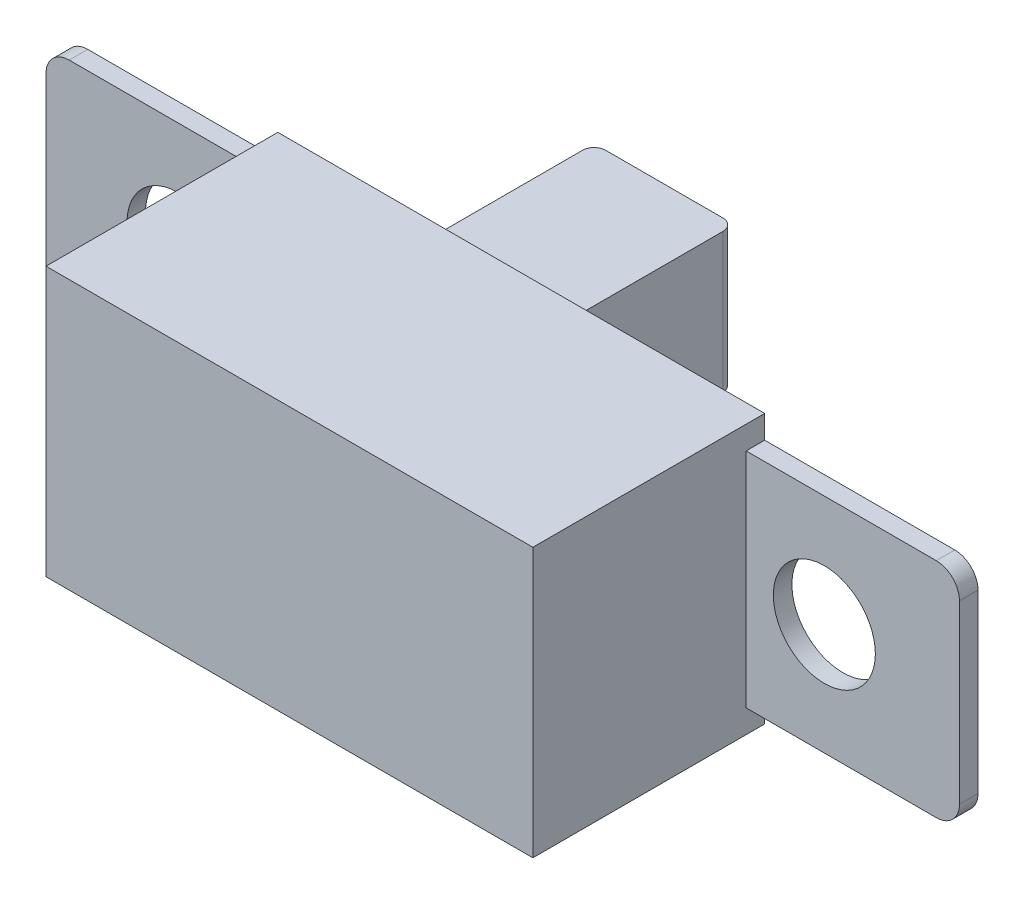
ISO-10303-21;
HEADER;
FILE_DESCRIPTION(('STEP AP214'),'2;1');
FILE_NAME('part.step','',(''),(''),'','','');
FILE_SCHEMA(('AUTOMOTIVE_DESIGN { 1 0 10303 214 1 1 1 1 }'));
ENDSEC;
DATA;
#1=APPLICATION_CONTEXT('core data for automotive mechanical design processes');
#2=APPLICATION_PROTOCOL_DEFINITION('international standard','automotive_design',2000,#1);
#3=PRODUCT_CONTEXT('',#1,'mechanical');
#4=PRODUCT('Part','Part','',(#3));
#5=PRODUCT_RELATED_PRODUCT_CATEGORY('part','',(#4));
#6=PRODUCT_DEFINITION_FORMATION('','',#4);
#7=PRODUCT_DEFINITION_CONTEXT('part definition',#1,'design');
#8=PRODUCT_DEFINITION('design','',#6,#7);
#9=PRODUCT_DEFINITION_SHAPE('','',#8);
#10=(LENGTH_UNIT() NAMED_UNIT(*) SI_UNIT(.MILLI.,.METRE.));
#11=(NAMED_UNIT(*) PLANE_ANGLE_UNIT() SI_UNIT($,.RADIAN.));
#12=(NAMED_UNIT(*) SI_UNIT($,.STERADIAN.) SOLID_ANGLE_UNIT());
#13=UNCERTAINTY_MEASURE_WITH_UNIT(LENGTH_MEASURE(1.E-05),#10,'distance_accuracy_value','');
#14=(GEOMETRIC_REPRESENTATION_CONTEXT(3) GLOBAL_UNCERTAINTY_ASSIGNED_CONTEXT((#13)) GLOBAL_UNIT_ASSIGNED_CONTEXT((#10,
#11,#12)) REPRESENTATION_CONTEXT('',''));
#15=CARTESIAN_POINT('',(0.,0.,0.));
#16=DIRECTION('',(0.,0.,1.));
#17=DIRECTION('',(1.,0.,0.));
#18=AXIS2_PLACEMENT_3D('',#15,#16,#17);
#19=CARTESIAN_POINT('',(-3.48412188827011,1.5,0.4));
#20=DIRECTION('',(0.,-1.,0.));
#21=DIRECTION('',(0.,0.,-1.));
#22=AXIS2_PLACEMENT_3D('',#19,#20,#21);
#23=PLANE('',#22);
#24=DIRECTION('',(-1.,0.,0.));
#25=VECTOR('',#24,1.);
#26=CARTESIAN_POINT('',(-3.48412188827011,1.5,0.));
#27=LINE('',#26,#25);
#28=CARTESIAN_POINT('',(-3.02908302266392,1.5,0.));
#29=VERTEX_POINT('',#28);
#30=CARTESIAN_POINT('',(-3.48412188827011,1.5,0.));
#31=VERTEX_POINT('',#30);
#32=EDGE_CURVE('E238',#29,#31,#27,.T.);
#33=ORIENTED_EDGE('',*,*,#32,.F.);
#34=DIRECTION('',(0.,0.,1.));
#35=VECTOR('',#34,1.);
#36=CARTESIAN_POINT('',(-3.02908302266392,1.5,-4.6));
#37=LINE('',#36,#35);
#38=CARTESIAN_POINT('',(-3.02908302266392,1.5,0.4));
#39=VERTEX_POINT('',#38);
#40=EDGE_CURVE('E225',#29,#39,#37,.T.);
#41=ORIENTED_EDGE('',*,*,#40,.T.);
#42=DIRECTION('',(-1.,0.,0.));
#43=VECTOR('',#42,1.);
#44=CARTESIAN_POINT('',(-3.48412188827011,1.5,0.4));
#45=LINE('',#44,#43);
#46=CARTESIAN_POINT('',(-3.48412188827011,1.5,0.4));
#47=VERTEX_POINT('',#46);
#48=EDGE_CURVE('E236',#39,#47,#45,.T.);
#49=ORIENTED_EDGE('',*,*,#48,.T.);
#50=DIRECTION('',(0.,0.,-1.));
#51=VECTOR('',#50,1.);
#52=CARTESIAN_POINT('',(-3.48412188827011,1.5,0.4));
#53=LINE('',#52,#51);
#54=EDGE_CURVE('E279',#47,#31,#53,.T.);
#55=ORIENTED_EDGE('',*,*,#54,.T.);
#56=EDGE_LOOP('',(#33,#41,#49,#55));
#57=FACE_BOUND('',#56,.T.);
#58=ADVANCED_FACE('F38',(#57),#23,.T.);
#59=CARTESIAN_POINT('',(3.36036353667346,1.5,0.4));
#60=VERTEX_POINT('',#59);
#61=CARTESIAN_POINT('',(0.,1.5,0.4));
#62=VERTEX_POINT('',#61);
#63=EDGE_CURVE('E247',#60,#62,#45,.T.);
#64=ORIENTED_EDGE('',*,*,#63,.T.);
#65=DIRECTION('',(0.,0.,1.));
#66=VECTOR('',#65,1.);
#67=CARTESIAN_POINT('',(0.,1.5,-4.6));
#68=LINE('',#67,#66);
#69=CARTESIAN_POINT('',(0.,1.5,0.));
#70=VERTEX_POINT('',#69);
#71=EDGE_CURVE('E771',#70,#62,#68,.T.);
#72=ORIENTED_EDGE('',*,*,#71,.F.);
#73=CARTESIAN_POINT('',(3.36036353667346,1.5,0.));
#74=VERTEX_POINT('',#73);
#75=EDGE_CURVE('E265',#74,#70,#27,.T.);
#76=ORIENTED_EDGE('',*,*,#75,.F.);
#77=DIRECTION('',(0.,0.,-1.));
#78=VECTOR('',#77,1.);
#79=CARTESIAN_POINT('',(3.36036353667346,1.5,0.4));
#80=LINE('',#79,#78);
#81=EDGE_CURVE('E281',#60,#74,#80,.T.);
#82=ORIENTED_EDGE('',*,*,#81,.F.);
#83=EDGE_LOOP('',(#64,#72,#76,#82));
#84=FACE_BOUND('',#83,.T.);
#85=ADVANCED_FACE('F512',(#84),#23,.T.);
#86=CARTESIAN_POINT('',(-3.48412188827011,-1.5,0.4));
#87=DIRECTION('',(0.,1.,0.));
#88=DIRECTION('',(0.,0.,1.));
#89=AXIS2_PLACEMENT_3D('',#86,#87,#88);
#90=PLANE('',#89);
#91=DIRECTION('',(1.,0.,0.));
#92=VECTOR('',#91,1.);
#93=CARTESIAN_POINT('',(-3.48412188827011,-1.5,0.4));
#94=LINE('',#93,#92);
#95=CARTESIAN_POINT('',(-3.48412188827012,-1.5,0.4));
#96=VERTEX_POINT('',#95);
#97=CARTESIAN_POINT('',(-3.02908302266392,-1.5,0.4));
#98=VERTEX_POINT('',#97);
#99=EDGE_CURVE('E258',#96,#98,#94,.T.);
#100=ORIENTED_EDGE('',*,*,#99,.T.);
#101=DIRECTION('',(0.,0.,1.));
#102=VECTOR('',#101,1.);
#103=CARTESIAN_POINT('',(-3.02908302266392,-1.5,-4.6));
#104=LINE('',#103,#102);
#105=CARTESIAN_POINT('',(-3.02908302266392,-1.5,0.));
#106=VERTEX_POINT('',#105);
#107=EDGE_CURVE('E228',#106,#98,#104,.T.);
#108=ORIENTED_EDGE('',*,*,#107,.F.);
#109=DIRECTION('',(1.,0.,0.));
#110=VECTOR('',#109,1.);
#111=CARTESIAN_POINT('',(-3.48412188827011,-1.5,0.));
#112=LINE('',#111,#110);
#113=CARTESIAN_POINT('',(-3.48412188827011,-1.5,0.));
#114=VERTEX_POINT('',#113);
#115=EDGE_CURVE('E252',#114,#106,#112,.T.);
#116=ORIENTED_EDGE('',*,*,#115,.F.);
#117=DIRECTION('',(0.,0.,-1.));
#118=VECTOR('',#117,1.);
#119=CARTESIAN_POINT('',(-3.48412188827011,-1.5,0.4));
#120=LINE('',#119,#118);
#121=EDGE_CURVE('E277',#96,#114,#120,.T.);
#122=ORIENTED_EDGE('',*,*,#121,.F.);
#123=EDGE_LOOP('',(#100,#108,#116,#122));
#124=FACE_BOUND('',#123,.T.);
#125=ADVANCED_FACE('F517',(#124),#90,.T.);
#126=CARTESIAN_POINT('',(0.,-1.5,0.));
#127=VERTEX_POINT('',#126);
#128=CARTESIAN_POINT('',(3.36036353667346,-1.5,0.));
#129=VERTEX_POINT('',#128);
#130=EDGE_CURVE('E272',#127,#129,#112,.T.);
#131=ORIENTED_EDGE('',*,*,#130,.F.);
#132=DIRECTION('',(0.,0.,1.));
#133=VECTOR('',#132,1.);
#134=CARTESIAN_POINT('',(0.,-1.5,-4.6));
#135=LINE('',#134,#133);
#136=CARTESIAN_POINT('',(0.,-1.5,0.4));
#137=VERTEX_POINT('',#136);
#138=EDGE_CURVE('E775',#127,#137,#135,.T.);
#139=ORIENTED_EDGE('',*,*,#138,.T.);
#140=CARTESIAN_POINT('',(3.36036353667346,-1.5,0.4));
#141=VERTEX_POINT('',#140);
#142=EDGE_CURVE('E257',#137,#141,#94,.T.);
#143=ORIENTED_EDGE('',*,*,#142,.T.);
#144=DIRECTION('',(0.,0.,-1.));
#145=VECTOR('',#144,1.);
#146=CARTESIAN_POINT('',(3.36036353667346,-1.5,0.4));
#147=LINE('',#146,#145);
#148=EDGE_CURVE('E260',#141,#129,#147,.T.);
#149=ORIENTED_EDGE('',*,*,#148,.T.);
#150=EDGE_LOOP('',(#131,#139,#143,#149));
#151=FACE_BOUND('',#150,.T.);
#152=ADVANCED_FACE('F736',(#151),#90,.T.);
#153=CARTESIAN_POINT('',(-5.25,-14.3634200830293,0.4));
#154=DIRECTION('',(0.,0.,-1.));
#155=DIRECTION('',(-1.,0.,0.));
#156=AXIS2_PLACEMENT_3D('',#153,#154,#155);
#157=PLANE('',#156);
#158=ORIENTED_EDGE('',*,*,#48,.F.);
#159=DIRECTION('',(0.,1.,0.));
#160=VECTOR('',#159,1.);
#161=CARTESIAN_POINT('',(-3.02908302266392,-1.5,0.4));
#162=LINE('',#161,#160);
#163=EDGE_CURVE('E222',#98,#39,#162,.T.);
#164=ORIENTED_EDGE('',*,*,#163,.F.);
#165=ORIENTED_EDGE('',*,*,#99,.F.);
#166=DIRECTION('',(0.,-1.,0.));
#167=VECTOR('',#166,1.);
#168=CARTESIAN_POINT('',(-3.48412188827011,-1.5,0.4));
#169=LINE('',#168,#167);
#170=EDGE_CURVE('E245',#47,#96,#169,.T.);
#171=ORIENTED_EDGE('',*,*,#170,.F.);
#172=EDGE_LOOP('',(#158,#164,#165,#171));
#173=FACE_BOUND('',#172,.T.);
#174=ADVANCED_FACE('F243',(#173),#157,.T.);
#175=ORIENTED_EDGE('',*,*,#142,.F.);
#176=DIRECTION('',(0.,-1.,0.));
#177=VECTOR('',#176,1.);
#178=CARTESIAN_POINT('',(0.,-1.5,0.4));
#179=LINE('',#178,#177);
#180=EDGE_CURVE('E232',#62,#137,#179,.T.);
#181=ORIENTED_EDGE('',*,*,#180,.F.);
#182=ORIENTED_EDGE('',*,*,#63,.F.);
#183=DIRECTION('',(0.,1.,0.));
#184=VECTOR('',#183,1.);
#185=CARTESIAN_POINT('',(3.36036353667346,-1.5,0.4));
#186=LINE('',#185,#184);
#187=EDGE_CURVE('E248',#141,#60,#186,.T.);
#188=ORIENTED_EDGE('',*,*,#187,.F.);
#189=EDGE_LOOP('',(#175,#181,#182,#188));
#190=FACE_BOUND('',#189,.T.);
#191=ADVANCED_FACE('F722',(#190),#157,.T.);
#192=CARTESIAN_POINT('',(-9.35,1.9,0.4));
#193=DIRECTION('',(0.,0.,-1.));
#194=DIRECTION('',(-1.,0.,0.));
#195=AXIS2_PLACEMENT_3D('',#192,#193,#194);
#196=PLANE('',#195);
#197=CARTESIAN_POINT('',(6.93630364388336,0.,0.4));
#198=DIRECTION('',(0.,0.,1.));
#199=DIRECTION('',(1.,0.,0.));
#200=AXIS2_PLACEMENT_3D('',#197,#198,#199);
#201=CIRCLE('',#200,1.1);
#202=CARTESIAN_POINT('',(8.03630364388336,0.,0.4));
#203=VERTEX_POINT('',#202);
#204=EDGE_CURVE('E285',#203,#203,#201,.T.);
#205=ORIENTED_EDGE('',*,*,#204,.F.);
#206=EDGE_LOOP('',(#205));
#207=FACE_BOUND('',#206,.T.);
#208=DIRECTION('',(0.,1.,0.));
#209=VECTOR('',#208,1.);
#210=CARTESIAN_POINT('',(5.25,-14.3634200830293,0.4));
#211=LINE('',#210,#209);
#212=CARTESIAN_POINT('',(5.25,-2.4,0.4));
#213=VERTEX_POINT('',#212);
#214=CARTESIAN_POINT('',(5.25,2.4,0.4));
#215=VERTEX_POINT('',#214);
#216=EDGE_CURVE('E397',#213,#215,#211,.T.);
#217=ORIENTED_EDGE('',*,*,#216,.F.);
#218=DIRECTION('',(1.,0.,0.));
#219=VECTOR('',#218,1.);
#220=CARTESIAN_POINT('',(5.25,-2.4,0.4));
#221=LINE('',#220,#219);
#222=CARTESIAN_POINT('',(9.35,-2.4,0.4));
#223=VERTEX_POINT('',#222);
#224=EDGE_CURVE('E308',#213,#223,#221,.T.);
#225=ORIENTED_EDGE('',*,*,#224,.T.);
#226=CARTESIAN_POINT('',(9.35,-1.9,0.4));
#227=DIRECTION('',(0.,0.,1.));
#228=DIRECTION('',(1.,0.,0.));
#229=AXIS2_PLACEMENT_3D('',#226,#227,#228);
#230=CIRCLE('',#229,0.5);
#231=CARTESIAN_POINT('',(9.85,-1.9,0.4));
#232=VERTEX_POINT('',#231);
#233=EDGE_CURVE('E310',#223,#232,#230,.T.);
#234=ORIENTED_EDGE('',*,*,#233,.T.);
#235=DIRECTION('',(0.,1.,0.));
#236=VECTOR('',#235,1.);
#237=CARTESIAN_POINT('',(9.85,-1.9,0.4));
#238=LINE('',#237,#236);
#239=CARTESIAN_POINT('',(9.85,1.9,0.4));
#240=VERTEX_POINT('',#239);
#241=EDGE_CURVE('E312',#232,#240,#238,.T.);
#242=ORIENTED_EDGE('',*,*,#241,.T.);
#243=CARTESIAN_POINT('',(9.35,1.9,0.4));
#244=DIRECTION('',(0.,0.,1.));
#245=DIRECTION('',(-1.,0.,0.));
#246=AXIS2_PLACEMENT_3D('',#243,#244,#245);
#247=CIRCLE('',#246,0.5);
#248=CARTESIAN_POINT('',(9.35,2.4,0.4));
#249=VERTEX_POINT('',#248);
#250=EDGE_CURVE('E314',#240,#249,#247,.T.);
#251=ORIENTED_EDGE('',*,*,#250,.T.);
#252=DIRECTION('',(-1.,0.,0.));
#253=VECTOR('',#252,1.);
#254=CARTESIAN_POINT('',(5.25,2.4,0.4));
#255=LINE('',#254,#253);
#256=EDGE_CURVE('E316',#249,#215,#255,.T.);
#257=ORIENTED_EDGE('',*,*,#256,.T.);
#258=EDGE_LOOP('',(#217,#225,#234,#242,#251,#257));
#259=FACE_BOUND('',#258,.T.);
#260=ADVANCED_FACE('F538',(#207,#259),#196,.F.);
#261=CARTESIAN_POINT('',(-7.00196748145124,0.,0.4));
#262=DIRECTION('',(0.,0.,1.));
#263=DIRECTION('',(1.,0.,0.));
#264=AXIS2_PLACEMENT_3D('',#261,#262,#263);
#265=CIRCLE('',#264,1.1);
#266=CARTESIAN_POINT('',(-5.90196748145124,0.,0.4));
#267=VERTEX_POINT('',#266);
#268=EDGE_CURVE('E291',#267,#267,#265,.T.);
#269=ORIENTED_EDGE('',*,*,#268,.F.);
#270=EDGE_LOOP('',(#269));
#271=FACE_BOUND('',#270,.T.);
#272=DIRECTION('',(1.,0.,0.));
#273=VECTOR('',#272,1.);
#274=CARTESIAN_POINT('',(-9.34999999999999,-2.4,0.4));
#275=LINE('',#274,#273);
#276=CARTESIAN_POINT('',(-9.34999999999999,-2.4,0.4));
#277=VERTEX_POINT('',#276);
#278=CARTESIAN_POINT('',(-5.25,-2.4,0.4));
#279=VERTEX_POINT('',#278);
#280=EDGE_CURVE('E306',#277,#279,#275,.T.);
#281=ORIENTED_EDGE('',*,*,#280,.T.);
#282=DIRECTION('',(0.,1.,0.));
#283=VECTOR('',#282,1.);
#284=CARTESIAN_POINT('',(-5.25,-14.3634200830293,0.4));
#285=LINE('',#284,#283);
#286=CARTESIAN_POINT('',(-5.25,2.4,0.4));
#287=VERTEX_POINT('',#286);
#288=EDGE_CURVE('E402',#279,#287,#285,.T.);
#289=ORIENTED_EDGE('',*,*,#288,.T.);
#290=DIRECTION('',(-1.,0.,0.));
#291=VECTOR('',#290,1.);
#292=CARTESIAN_POINT('',(-9.34999999999999,2.4,0.4));
#293=LINE('',#292,#291);
#294=CARTESIAN_POINT('',(-9.34999999999999,2.4,0.4));
#295=VERTEX_POINT('',#294);
#296=EDGE_CURVE('E297',#287,#295,#293,.T.);
#297=ORIENTED_EDGE('',*,*,#296,.T.);
#298=CARTESIAN_POINT('',(-9.35,1.9,0.4));
#299=DIRECTION('',(0.,0.,1.));
#300=DIRECTION('',(-1.,0.,0.));
#301=AXIS2_PLACEMENT_3D('',#298,#299,#300);
#302=CIRCLE('',#301,0.5);
#303=CARTESIAN_POINT('',(-9.85,1.9,0.4));
#304=VERTEX_POINT('',#303);
#305=EDGE_CURVE('E299',#295,#304,#302,.T.);
#306=ORIENTED_EDGE('',*,*,#305,.T.);
#307=DIRECTION('',(0.,-1.,0.));
#308=VECTOR('',#307,1.);
#309=CARTESIAN_POINT('',(-9.85,-1.9,0.4));
#310=LINE('',#309,#308);
#311=CARTESIAN_POINT('',(-9.85,-1.9,0.4));
#312=VERTEX_POINT('',#311);
#313=EDGE_CURVE('E302',#304,#312,#310,.T.);
#314=ORIENTED_EDGE('',*,*,#313,.T.);
#315=CARTESIAN_POINT('',(-9.35,-1.9,0.4));
#316=DIRECTION('',(0.,0.,1.));
#317=DIRECTION('',(-1.,0.,0.));
#318=AXIS2_PLACEMENT_3D('',#315,#316,#317);
#319=CIRCLE('',#318,0.5);
#320=EDGE_CURVE('E304',#312,#277,#319,.T.);
#321=ORIENTED_EDGE('',*,*,#320,.T.);
#322=EDGE_LOOP('',(#281,#289,#297,#306,#314,#321));
#323=FACE_BOUND('',#322,.T.);
#324=ADVANCED_FACE('F487',(#271,#323),#196,.F.);
#325=CARTESIAN_POINT('',(-9.35,1.9,0.));
#326=DIRECTION('',(0.,0.,-1.));
#327=DIRECTION('',(-1.,0.,0.));
#328=AXIS2_PLACEMENT_3D('',#325,#326,#327);
#329=PLANE('',#328);
#330=CARTESIAN_POINT('',(-7.00196748145124,0.,0.));
#331=DIRECTION('',(0.,0.,1.));
#332=DIRECTION('',(1.,0.,0.));
#333=AXIS2_PLACEMENT_3D('',#330,#331,#332);
#334=CIRCLE('',#333,1.1);
#335=CARTESIAN_POINT('',(-5.90196748145124,0.,0.));
#336=VERTEX_POINT('',#335);
#337=EDGE_CURVE('E288',#336,#336,#334,.T.);
#338=ORIENTED_EDGE('',*,*,#337,.T.);
#339=EDGE_LOOP('',(#338));
#340=FACE_BOUND('',#339,.T.);
#341=DIRECTION('',(0.,1.,0.));
#342=VECTOR('',#341,1.);
#343=CARTESIAN_POINT('',(5.25,2.4,0.));
#344=LINE('',#343,#342);
#345=CARTESIAN_POINT('',(5.25,2.4,0.));
#346=VERTEX_POINT('',#345);
#347=CARTESIAN_POINT('',(5.25,2.9,0.));
#348=VERTEX_POINT('',#347);
#349=EDGE_CURVE('E294',#346,#348,#344,.T.);
#350=ORIENTED_EDGE('',*,*,#349,.F.);
#351=DIRECTION('',(-1.,0.,0.));
#352=VECTOR('',#351,1.);
#353=CARTESIAN_POINT('',(5.25,2.4,0.));
#354=LINE('',#353,#352);
#355=CARTESIAN_POINT('',(9.35,2.4,0.));
#356=VERTEX_POINT('',#355);
#357=EDGE_CURVE('E300',#356,#346,#354,.T.);
#358=ORIENTED_EDGE('',*,*,#357,.F.);
#359=CARTESIAN_POINT('',(9.35,1.9,0.));
#360=DIRECTION('',(0.,0.,1.));
#361=DIRECTION('',(-1.,0.,0.));
#362=AXIS2_PLACEMENT_3D('',#359,#360,#361);
#363=CIRCLE('',#362,0.5);
#364=CARTESIAN_POINT('',(9.85,1.9,0.));
#365=VERTEX_POINT('',#364);
#366=EDGE_CURVE('E347',#365,#356,#363,.T.);
#367=ORIENTED_EDGE('',*,*,#366,.F.);
#368=DIRECTION('',(0.,1.,0.));
#369=VECTOR('',#368,1.);
#370=CARTESIAN_POINT('',(9.85,-1.9,0.));
#371=LINE('',#370,#369);
#372=CARTESIAN_POINT('',(9.85,-1.9,0.));
#373=VERTEX_POINT('',#372);
#374=EDGE_CURVE('E345',#373,#365,#371,.T.);
#375=ORIENTED_EDGE('',*,*,#374,.F.);
#376=CARTESIAN_POINT('',(9.35,-1.9,0.));
#377=DIRECTION('',(0.,0.,1.));
#378=DIRECTION('',(1.,0.,0.));
#379=AXIS2_PLACEMENT_3D('',#376,#377,#378);
#380=CIRCLE('',#379,0.5);
#381=CARTESIAN_POINT('',(9.35,-2.4,0.));
#382=VERTEX_POINT('',#381);
#383=EDGE_CURVE('E343',#382,#373,#380,.T.);
#384=ORIENTED_EDGE('',*,*,#383,.F.);
#385=DIRECTION('',(1.,0.,0.));
#386=VECTOR('',#385,1.);
#387=CARTESIAN_POINT('',(5.25,-2.4,0.));
#388=LINE('',#387,#386);
#389=CARTESIAN_POINT('',(5.25,-2.4,0.));
#390=VERTEX_POINT('',#389);
#391=EDGE_CURVE('E341',#390,#382,#388,.T.);
#392=ORIENTED_EDGE('',*,*,#391,.F.);
#393=DIRECTION('',(0.,1.,0.));
#394=VECTOR('',#393,1.);
#395=CARTESIAN_POINT('',(5.25,-2.9,0.));
#396=LINE('',#395,#394);
#397=CARTESIAN_POINT('',(5.25,-2.9,0.));
#398=VERTEX_POINT('',#397);
#399=EDGE_CURVE('E339',#398,#390,#396,.T.);
#400=ORIENTED_EDGE('',*,*,#399,.F.);
#401=DIRECTION('',(1.,0.,0.));
#402=VECTOR('',#401,1.);
#403=CARTESIAN_POINT('',(-5.25,-2.9,0.));
#404=LINE('',#403,#402);
#405=CARTESIAN_POINT('',(-5.25,-2.9,0.));
#406=VERTEX_POINT('',#405);
#407=EDGE_CURVE('E337',#406,#398,#404,.T.);
#408=ORIENTED_EDGE('',*,*,#407,.F.);
#409=DIRECTION('',(0.,-1.,0.));
#410=VECTOR('',#409,1.);
#411=CARTESIAN_POINT('',(-5.25,-2.9,0.));
#412=LINE('',#411,#410);
#413=CARTESIAN_POINT('',(-5.25,-2.4,0.));
#414=VERTEX_POINT('',#413);
#415=EDGE_CURVE('E335',#414,#406,#412,.T.);
#416=ORIENTED_EDGE('',*,*,#415,.F.);
#417=DIRECTION('',(1.,0.,0.));
#418=VECTOR('',#417,1.);
#419=CARTESIAN_POINT('',(-9.34999999999999,-2.4,0.));
#420=LINE('',#419,#418);
#421=CARTESIAN_POINT('',(-9.34999999999999,-2.4,0.));
#422=VERTEX_POINT('',#421);
#423=EDGE_CURVE('E333',#422,#414,#420,.T.);
#424=ORIENTED_EDGE('',*,*,#423,.F.);
#425=CARTESIAN_POINT('',(-9.35,-1.9,0.));
#426=DIRECTION('',(0.,0.,1.));
#427=DIRECTION('',(-1.,0.,0.));
#428=AXIS2_PLACEMENT_3D('',#425,#426,#427);
#429=CIRCLE('',#428,0.5);
#430=CARTESIAN_POINT('',(-9.85,-1.9,0.));
#431=VERTEX_POINT('',#430);
#432=EDGE_CURVE('E331',#431,#422,#429,.T.);
#433=ORIENTED_EDGE('',*,*,#432,.F.);
#434=DIRECTION('',(0.,-1.,0.));
#435=VECTOR('',#434,1.);
#436=CARTESIAN_POINT('',(-9.85,-1.9,0.));
#437=LINE('',#436,#435);
#438=CARTESIAN_POINT('',(-9.85,1.9,0.));
#439=VERTEX_POINT('',#438);
#440=EDGE_CURVE('E329',#439,#431,#437,.T.);
#441=ORIENTED_EDGE('',*,*,#440,.F.);
#442=CARTESIAN_POINT('',(-9.35,1.9,0.));
#443=DIRECTION('',(0.,0.,1.));
#444=DIRECTION('',(-1.,0.,0.));
#445=AXIS2_PLACEMENT_3D('',#442,#443,#444);
#446=CIRCLE('',#445,0.5);
#447=CARTESIAN_POINT('',(-9.34999999999999,2.4,0.));
#448=VERTEX_POINT('',#447);
#449=EDGE_CURVE('E327',#448,#439,#446,.T.);
#450=ORIENTED_EDGE('',*,*,#449,.F.);
#451=DIRECTION('',(-1.,0.,0.));
#452=VECTOR('',#451,1.);
#453=CARTESIAN_POINT('',(-9.34999999999999,2.4,0.));
#454=LINE('',#453,#452);
#455=CARTESIAN_POINT('',(-5.25,2.4,0.));
#456=VERTEX_POINT('',#455);
#457=EDGE_CURVE('E325',#456,#448,#454,.T.);
#458=ORIENTED_EDGE('',*,*,#457,.F.);
#459=DIRECTION('',(0.,-1.,0.));
#460=VECTOR('',#459,1.);
#461=CARTESIAN_POINT('',(-5.25,2.4,0.));
#462=LINE('',#461,#460);
#463=CARTESIAN_POINT('',(-5.25,2.9,0.));
#464=VERTEX_POINT('',#463);
#465=EDGE_CURVE('E323',#464,#456,#462,.T.);
#466=ORIENTED_EDGE('',*,*,#465,.F.);
#467=DIRECTION('',(-1.,0.,0.));
#468=VECTOR('',#467,1.);
#469=CARTESIAN_POINT('',(-5.25,2.9,0.));
#470=LINE('',#469,#468);
#471=EDGE_CURVE('E321',#348,#464,#470,.T.);
#472=ORIENTED_EDGE('',*,*,#471,.F.);
#473=EDGE_LOOP('',(#350,#358,#367,#375,#384,#392,#400,#408,#416,#424,#433,#441,#450,#458,#466,#472));
#474=FACE_BOUND('',#473,.T.);
#475=CARTESIAN_POINT('',(6.93630364388336,0.,0.));
#476=DIRECTION('',(0.,0.,1.));
#477=DIRECTION('',(1.,0.,0.));
#478=AXIS2_PLACEMENT_3D('',#475,#476,#477);
#479=CIRCLE('',#478,1.1);
#480=CARTESIAN_POINT('',(8.03630364388336,0.,0.));
#481=VERTEX_POINT('',#480);
#482=EDGE_CURVE('E284',#481,#481,#479,.T.);
#483=ORIENTED_EDGE('',*,*,#482,.T.);
#484=EDGE_LOOP('',(#483));
#485=FACE_BOUND('',#484,.T.);
#486=ORIENTED_EDGE('',*,*,#115,.T.);
#487=DIRECTION('',(1.,0.,0.));
#488=VECTOR('',#487,1.);
#489=CARTESIAN_POINT('',(-9.35,-1.5,0.));
#490=LINE('',#489,#488);
#491=EDGE_CURVE('E429',#106,#127,#490,.T.);
#492=ORIENTED_EDGE('',*,*,#491,.T.);
#493=ORIENTED_EDGE('',*,*,#130,.T.);
#494=DIRECTION('',(0.,1.,0.));
#495=VECTOR('',#494,1.);
#496=CARTESIAN_POINT('',(3.36036353667346,-1.5,0.));
#497=LINE('',#496,#495);
#498=EDGE_CURVE('E261',#129,#74,#497,.T.);
#499=ORIENTED_EDGE('',*,*,#498,.T.);
#500=ORIENTED_EDGE('',*,*,#75,.T.);
#501=DIRECTION('',(-1.,0.,0.));
#502=VECTOR('',#501,1.);
#503=CARTESIAN_POINT('',(-9.35,1.5,0.));
#504=LINE('',#503,#502);
#505=EDGE_CURVE('E431',#70,#29,#504,.T.);
#506=ORIENTED_EDGE('',*,*,#505,.T.);
#507=ORIENTED_EDGE('',*,*,#32,.T.);
#508=DIRECTION('',(0.,-1.,0.));
#509=VECTOR('',#508,1.);
#510=CARTESIAN_POINT('',(-3.48412188827011,-1.5,0.));
#511=LINE('',#510,#509);
#512=EDGE_CURVE('E268',#31,#114,#511,.T.);
#513=ORIENTED_EDGE('',*,*,#512,.T.);
#514=EDGE_LOOP('',(#486,#492,#493,#499,#500,#506,#507,#513));
#515=FACE_BOUND('',#514,.T.);
#516=ADVANCED_FACE('F467',(#340,#474,#485,#515),#329,.T.);
#517=CARTESIAN_POINT('',(-5.25,2.9,0.4));
#518=DIRECTION('',(0.,-1.,0.));
#519=DIRECTION('',(0.,0.,-1.));
#520=AXIS2_PLACEMENT_3D('',#517,#518,#519);
#521=PLANE('',#520);
#522=ORIENTED_EDGE('',*,*,#471,.T.);
#523=DIRECTION('',(0.,0.,-1.));
#524=VECTOR('',#523,1.);
#525=CARTESIAN_POINT('',(-5.25,2.9,0.4));
#526=LINE('',#525,#524);
#527=CARTESIAN_POINT('',(-5.25,2.9,5.));
#528=VERTEX_POINT('',#527);
#529=EDGE_CURVE('E391',#528,#464,#526,.T.);
#530=ORIENTED_EDGE('',*,*,#529,.F.);
#531=DIRECTION('',(1.,0.,0.));
#532=VECTOR('',#531,1.);
#533=CARTESIAN_POINT('',(-5.25,2.9,5.));
#534=LINE('',#533,#532);
#535=CARTESIAN_POINT('',(5.25,2.9,5.));
#536=VERTEX_POINT('',#535);
#537=EDGE_CURVE('E437',#528,#536,#534,.T.);
#538=ORIENTED_EDGE('',*,*,#537,.T.);
#539=DIRECTION('',(0.,0.,-1.));
#540=VECTOR('',#539,1.);
#541=CARTESIAN_POINT('',(5.25,2.9,0.4));
#542=LINE('',#541,#540);
#543=EDGE_CURVE('E394',#536,#348,#542,.T.);
#544=ORIENTED_EDGE('',*,*,#543,.T.);
#545=EDGE_LOOP('',(#522,#530,#538,#544));
#546=FACE_BOUND('',#545,.T.);
#547=ADVANCED_FACE('F476',(#546),#521,.F.);
#548=CARTESIAN_POINT('',(-9.34999999999999,2.4,0.4));
#549=DIRECTION('',(0.,-1.,0.));
#550=DIRECTION('',(0.,0.,-1.));
#551=AXIS2_PLACEMENT_3D('',#548,#549,#550);
#552=PLANE('',#551);
#553=ORIENTED_EDGE('',*,*,#457,.T.);
#554=DIRECTION('',(0.,0.,-1.));
#555=VECTOR('',#554,1.);
#556=CARTESIAN_POINT('',(-9.34999999999999,2.4,0.4));
#557=LINE('',#556,#555);
#558=EDGE_CURVE('E385',#295,#448,#557,.T.);
#559=ORIENTED_EDGE('',*,*,#558,.F.);
#560=ORIENTED_EDGE('',*,*,#296,.F.);
#561=DIRECTION('',(0.,0.,-1.));
#562=VECTOR('',#561,1.);
#563=CARTESIAN_POINT('',(-5.25,2.4,0.4));
#564=LINE('',#563,#562);
#565=EDGE_CURVE('E388',#287,#456,#564,.T.);
#566=ORIENTED_EDGE('',*,*,#565,.T.);
#567=EDGE_LOOP('',(#553,#559,#560,#566));
#568=FACE_BOUND('',#567,.T.);
#569=ADVANCED_FACE('F483',(#568),#552,.F.);
#570=CARTESIAN_POINT('',(-9.35,1.9,0.4));
#571=DIRECTION('',(0.,0.,-1.));
#572=DIRECTION('',(-1.,0.,0.));
#573=AXIS2_PLACEMENT_3D('',#570,#571,#572);
#574=CYLINDRICAL_SURFACE('',#573,0.5);
#575=ORIENTED_EDGE('',*,*,#449,.T.);
#576=DIRECTION('',(0.,0.,-1.));
#577=VECTOR('',#576,1.);
#578=CARTESIAN_POINT('',(-9.85,1.9,0.4));
#579=LINE('',#578,#577);
#580=EDGE_CURVE('E382',#304,#439,#579,.T.);
#581=ORIENTED_EDGE('',*,*,#580,.F.);
#582=ORIENTED_EDGE('',*,*,#305,.F.);
#583=ORIENTED_EDGE('',*,*,#558,.T.);
#584=EDGE_LOOP('',(#575,#581,#582,#583));
#585=FACE_BOUND('',#584,.T.);
#586=ADVANCED_FACE('F502',(#585),#574,.T.);
#587=CARTESIAN_POINT('',(-9.85,-1.9,0.4));
#588=DIRECTION('',(1.,0.,0.));
#589=DIRECTION('',(0.,0.,-1.));
#590=AXIS2_PLACEMENT_3D('',#587,#588,#589);
#591=PLANE('',#590);
#592=ORIENTED_EDGE('',*,*,#440,.T.);
#593=DIRECTION('',(0.,0.,-1.));
#594=VECTOR('',#593,1.);
#595=CARTESIAN_POINT('',(-9.85,-1.9,0.4));
#596=LINE('',#595,#594);
#597=EDGE_CURVE('E379',#312,#431,#596,.T.);
#598=ORIENTED_EDGE('',*,*,#597,.F.);
#599=ORIENTED_EDGE('',*,*,#313,.F.);
#600=ORIENTED_EDGE('',*,*,#580,.T.);
#601=EDGE_LOOP('',(#592,#598,#599,#600));
#602=FACE_BOUND('',#601,.T.);
#603=ADVANCED_FACE('F499',(#602),#591,.F.);
#604=CARTESIAN_POINT('',(-9.35,-1.9,0.4));
#605=DIRECTION('',(0.,0.,-1.));
#606=DIRECTION('',(-1.,0.,0.));
#607=AXIS2_PLACEMENT_3D('',#604,#605,#606);
#608=CYLINDRICAL_SURFACE('',#607,0.5);
#609=ORIENTED_EDGE('',*,*,#432,.T.);
#610=DIRECTION('',(0.,0.,-1.));
#611=VECTOR('',#610,1.);
#612=CARTESIAN_POINT('',(-9.34999999999999,-2.4,0.4));
#613=LINE('',#612,#611);
#614=EDGE_CURVE('E376',#277,#422,#613,.T.);
#615=ORIENTED_EDGE('',*,*,#614,.F.);
#616=ORIENTED_EDGE('',*,*,#320,.F.);
#617=ORIENTED_EDGE('',*,*,#597,.T.);
#618=EDGE_LOOP('',(#609,#615,#616,#617));
#619=FACE_BOUND('',#618,.T.);
#620=ADVANCED_FACE('F495',(#619),#608,.T.);
#621=CARTESIAN_POINT('',(-9.34999999999999,-2.4,0.4));
#622=DIRECTION('',(0.,1.,0.));
#623=DIRECTION('',(0.,0.,1.));
#624=AXIS2_PLACEMENT_3D('',#621,#622,#623);
#625=PLANE('',#624);
#626=ORIENTED_EDGE('',*,*,#423,.T.);
#627=DIRECTION('',(0.,0.,-1.));
#628=VECTOR('',#627,1.);
#629=CARTESIAN_POINT('',(-5.25,-2.4,0.4));
#630=LINE('',#629,#628);
#631=EDGE_CURVE('E373',#279,#414,#630,.T.);
#632=ORIENTED_EDGE('',*,*,#631,.F.);
#633=ORIENTED_EDGE('',*,*,#280,.F.);
#634=ORIENTED_EDGE('',*,*,#614,.T.);
#635=EDGE_LOOP('',(#626,#632,#633,#634));
#636=FACE_BOUND('',#635,.T.);
#637=ADVANCED_FACE('F493',(#636),#625,.F.);
#638=CARTESIAN_POINT('',(-5.25,-2.9,0.4));
#639=DIRECTION('',(1.,0.,0.));
#640=DIRECTION('',(0.,0.,-1.));
#641=AXIS2_PLACEMENT_3D('',#638,#639,#640);
#642=PLANE('',#641);
#643=ORIENTED_EDGE('',*,*,#415,.T.);
#644=DIRECTION('',(0.,0.,-1.));
#645=VECTOR('',#644,1.);
#646=CARTESIAN_POINT('',(-5.25,-2.9,0.4));
#647=LINE('',#646,#645);
#648=CARTESIAN_POINT('',(-5.25,-2.9,5.));
#649=VERTEX_POINT('',#648);
#650=EDGE_CURVE('E370',#649,#406,#647,.T.);
#651=ORIENTED_EDGE('',*,*,#650,.F.);
#652=DIRECTION('',(0.,1.,0.));
#653=VECTOR('',#652,1.);
#654=CARTESIAN_POINT('',(-5.25,-14.3634200830293,5.));
#655=LINE('',#654,#653);
#656=EDGE_CURVE('E440',#649,#528,#655,.T.);
#657=ORIENTED_EDGE('',*,*,#656,.T.);
#658=ORIENTED_EDGE('',*,*,#529,.T.);
#659=ORIENTED_EDGE('',*,*,#465,.T.);
#660=ORIENTED_EDGE('',*,*,#565,.F.);
#661=ORIENTED_EDGE('',*,*,#288,.F.);
#662=ORIENTED_EDGE('',*,*,#631,.T.);
#663=EDGE_LOOP('',(#643,#651,#657,#658,#659,#660,#661,#662));
#664=FACE_BOUND('',#663,.T.);
#665=ADVANCED_FACE('F459',(#664),#642,.F.);
#666=CARTESIAN_POINT('',(-5.25,-2.9,0.4));
#667=DIRECTION('',(0.,1.,0.));
#668=DIRECTION('',(0.,0.,1.));
#669=AXIS2_PLACEMENT_3D('',#666,#667,#668);
#670=PLANE('',#669);
#671=ORIENTED_EDGE('',*,*,#407,.T.);
#672=DIRECTION('',(0.,0.,-1.));
#673=VECTOR('',#672,1.);
#674=CARTESIAN_POINT('',(5.25,-2.9,0.4));
#675=LINE('',#674,#673);
#676=CARTESIAN_POINT('',(5.25,-2.9,5.));
#677=VERTEX_POINT('',#676);
#678=EDGE_CURVE('E367',#677,#398,#675,.T.);
#679=ORIENTED_EDGE('',*,*,#678,.F.);
#680=DIRECTION('',(-1.,0.,0.));
#681=VECTOR('',#680,1.);
#682=CARTESIAN_POINT('',(-5.25,-2.9,5.));
#683=LINE('',#682,#681);
#684=EDGE_CURVE('E264',#677,#649,#683,.T.);
#685=ORIENTED_EDGE('',*,*,#684,.T.);
#686=ORIENTED_EDGE('',*,*,#650,.T.);
#687=EDGE_LOOP('',(#671,#679,#685,#686));
#688=FACE_BOUND('',#687,.T.);
#689=ADVANCED_FACE('F452',(#688),#670,.F.);
#690=CARTESIAN_POINT('',(5.25,-2.9,0.4));
#691=DIRECTION('',(-1.,0.,0.));
#692=DIRECTION('',(0.,0.,1.));
#693=AXIS2_PLACEMENT_3D('',#690,#691,#692);
#694=PLANE('',#693);
#695=ORIENTED_EDGE('',*,*,#399,.T.);
#696=DIRECTION('',(0.,0.,-1.));
#697=VECTOR('',#696,1.);
#698=CARTESIAN_POINT('',(5.25,-2.4,0.4));
#699=LINE('',#698,#697);
#700=EDGE_CURVE('E364',#213,#390,#699,.T.);
#701=ORIENTED_EDGE('',*,*,#700,.F.);
#702=ORIENTED_EDGE('',*,*,#216,.T.);
#703=DIRECTION('',(0.,0.,-1.));
#704=VECTOR('',#703,1.);
#705=CARTESIAN_POINT('',(5.25,2.4,0.4));
#706=LINE('',#705,#704);
#707=EDGE_CURVE('E318',#215,#346,#706,.T.);
#708=ORIENTED_EDGE('',*,*,#707,.T.);
#709=ORIENTED_EDGE('',*,*,#349,.T.);
#710=ORIENTED_EDGE('',*,*,#543,.F.);
#711=DIRECTION('',(0.,1.,0.));
#712=VECTOR('',#711,1.);
#713=CARTESIAN_POINT('',(5.25,-14.3634200830293,5.));
#714=LINE('',#713,#712);
#715=EDGE_CURVE('E444',#677,#536,#714,.T.);
#716=ORIENTED_EDGE('',*,*,#715,.F.);
#717=ORIENTED_EDGE('',*,*,#678,.T.);
#718=EDGE_LOOP('',(#695,#701,#702,#708,#709,#710,#716,#717));
#719=FACE_BOUND('',#718,.T.);
#720=ADVANCED_FACE('F473',(#719),#694,.F.);
#721=CARTESIAN_POINT('',(5.25,-2.4,0.4));
#722=DIRECTION('',(0.,1.,0.));
#723=DIRECTION('',(-1.,0.,0.));
#724=AXIS2_PLACEMENT_3D('',#721,#722,#723);
#725=PLANE('',#724);
#726=ORIENTED_EDGE('',*,*,#391,.T.);
#727=DIRECTION('',(0.,0.,-1.));
#728=VECTOR('',#727,1.);
#729=CARTESIAN_POINT('',(9.35,-2.4,0.4));
#730=LINE('',#729,#728);
#731=EDGE_CURVE('E361',#223,#382,#730,.T.);
#732=ORIENTED_EDGE('',*,*,#731,.F.);
#733=ORIENTED_EDGE('',*,*,#224,.F.);
#734=ORIENTED_EDGE('',*,*,#700,.T.);
#735=EDGE_LOOP('',(#726,#732,#733,#734));
#736=FACE_BOUND('',#735,.T.);
#737=ADVANCED_FACE('F557',(#736),#725,.F.);
#738=CARTESIAN_POINT('',(9.35,-1.9,0.4));
#739=DIRECTION('',(0.,0.,-1.));
#740=DIRECTION('',(-1.,0.,0.));
#741=AXIS2_PLACEMENT_3D('',#738,#739,#740);
#742=CYLINDRICAL_SURFACE('',#741,0.5);
#743=ORIENTED_EDGE('',*,*,#383,.T.);
#744=DIRECTION('',(0.,0.,-1.));
#745=VECTOR('',#744,1.);
#746=CARTESIAN_POINT('',(9.85,-1.9,0.4));
#747=LINE('',#746,#745);
#748=EDGE_CURVE('E358',#232,#373,#747,.T.);
#749=ORIENTED_EDGE('',*,*,#748,.F.);
#750=ORIENTED_EDGE('',*,*,#233,.F.);
#751=ORIENTED_EDGE('',*,*,#731,.T.);
#752=EDGE_LOOP('',(#743,#749,#750,#751));
#753=FACE_BOUND('',#752,.T.);
#754=ADVANCED_FACE('F553',(#753),#742,.T.);
#755=CARTESIAN_POINT('',(9.85,-1.9,0.4));
#756=DIRECTION('',(-1.,0.,0.));
#757=DIRECTION('',(0.,0.,1.));
#758=AXIS2_PLACEMENT_3D('',#755,#756,#757);
#759=PLANE('',#758);
#760=ORIENTED_EDGE('',*,*,#374,.T.);
#761=DIRECTION('',(0.,0.,-1.));
#762=VECTOR('',#761,1.);
#763=CARTESIAN_POINT('',(9.85,1.9,0.4));
#764=LINE('',#763,#762);
#765=EDGE_CURVE('E355',#240,#365,#764,.T.);
#766=ORIENTED_EDGE('',*,*,#765,.F.);
#767=ORIENTED_EDGE('',*,*,#241,.F.);
#768=ORIENTED_EDGE('',*,*,#748,.T.);
#769=EDGE_LOOP('',(#760,#766,#767,#768));
#770=FACE_BOUND('',#769,.T.);
#771=ADVANCED_FACE('F549',(#770),#759,.F.);
#772=CARTESIAN_POINT('',(9.35,1.9,0.4));
#773=DIRECTION('',(0.,0.,-1.));
#774=DIRECTION('',(-1.,0.,0.));
#775=AXIS2_PLACEMENT_3D('',#772,#773,#774);
#776=CYLINDRICAL_SURFACE('',#775,0.5);
#777=ORIENTED_EDGE('',*,*,#366,.T.);
#778=DIRECTION('',(0.,0.,-1.));
#779=VECTOR('',#778,1.);
#780=CARTESIAN_POINT('',(9.35,2.4,0.4));
#781=LINE('',#780,#779);
#782=EDGE_CURVE('E352',#249,#356,#781,.T.);
#783=ORIENTED_EDGE('',*,*,#782,.F.);
#784=ORIENTED_EDGE('',*,*,#250,.F.);
#785=ORIENTED_EDGE('',*,*,#765,.T.);
#786=EDGE_LOOP('',(#777,#783,#784,#785));
#787=FACE_BOUND('',#786,.T.);
#788=ADVANCED_FACE('F545',(#787),#776,.T.);
#789=CARTESIAN_POINT('',(5.25,2.4,0.4));
#790=DIRECTION('',(0.,-1.,0.));
#791=DIRECTION('',(1.,0.,0.));
#792=AXIS2_PLACEMENT_3D('',#789,#790,#791);
#793=PLANE('',#792);
#794=ORIENTED_EDGE('',*,*,#357,.T.);
#795=ORIENTED_EDGE('',*,*,#707,.F.);
#796=ORIENTED_EDGE('',*,*,#256,.F.);
#797=ORIENTED_EDGE('',*,*,#782,.T.);
#798=EDGE_LOOP('',(#794,#795,#796,#797));
#799=FACE_BOUND('',#798,.T.);
#800=ADVANCED_FACE('F534',(#799),#793,.F.);
#801=CARTESIAN_POINT('',(-7.00196748145124,0.,0.4));
#802=DIRECTION('',(0.,0.,-1.));
#803=DIRECTION('',(-1.,0.,0.));
#804=AXIS2_PLACEMENT_3D('',#801,#802,#803);
#805=CYLINDRICAL_SURFACE('',#804,1.1);
#806=ORIENTED_EDGE('',*,*,#268,.T.);
#807=EDGE_LOOP('',(#806));
#808=FACE_BOUND('',#807,.T.);
#809=ORIENTED_EDGE('',*,*,#337,.F.);
#810=EDGE_LOOP('',(#809));
#811=FACE_BOUND('',#810,.T.);
#812=ADVANCED_FACE('F530',(#808,#811),#805,.F.);
#813=CARTESIAN_POINT('',(6.93630364388336,0.,0.4));
#814=DIRECTION('',(0.,0.,-1.));
#815=DIRECTION('',(-1.,0.,0.));
#816=AXIS2_PLACEMENT_3D('',#813,#814,#815);
#817=CYLINDRICAL_SURFACE('',#816,1.1);
#818=ORIENTED_EDGE('',*,*,#204,.T.);
#819=EDGE_LOOP('',(#818));
#820=FACE_BOUND('',#819,.T.);
#821=ORIENTED_EDGE('',*,*,#482,.F.);
#822=EDGE_LOOP('',(#821));
#823=FACE_BOUND('',#822,.T.);
#824=ADVANCED_FACE('F526',(#820,#823),#817,.F.);
#825=CARTESIAN_POINT('',(3.36036353667346,-1.5,0.4));
#826=DIRECTION('',(-1.,0.,0.));
#827=DIRECTION('',(0.,-1.,0.));
#828=AXIS2_PLACEMENT_3D('',#825,#826,#827);
#829=PLANE('',#828);
#830=ORIENTED_EDGE('',*,*,#498,.F.);
#831=ORIENTED_EDGE('',*,*,#148,.F.);
#832=ORIENTED_EDGE('',*,*,#187,.T.);
#833=ORIENTED_EDGE('',*,*,#81,.T.);
#834=EDGE_LOOP('',(#830,#831,#832,#833));
#835=FACE_BOUND('',#834,.T.);
#836=ADVANCED_FACE('F523',(#835),#829,.T.);
#837=CARTESIAN_POINT('',(-3.48412188827011,-1.5,0.4));
#838=DIRECTION('',(1.,0.,0.));
#839=DIRECTION('',(0.,1.,0.));
#840=AXIS2_PLACEMENT_3D('',#837,#838,#839);
#841=PLANE('',#840);
#842=ORIENTED_EDGE('',*,*,#512,.F.);
#843=ORIENTED_EDGE('',*,*,#54,.F.);
#844=ORIENTED_EDGE('',*,*,#170,.T.);
#845=ORIENTED_EDGE('',*,*,#121,.T.);
#846=EDGE_LOOP('',(#842,#843,#844,#845));
#847=FACE_BOUND('',#846,.T.);
#848=ADVANCED_FACE('F521',(#847),#841,.T.);
#849=CARTESIAN_POINT('',(-5.25,-14.3634200830293,5.));
#850=DIRECTION('',(0.,0.,1.));
#851=DIRECTION('',(1.,0.,0.));
#852=AXIS2_PLACEMENT_3D('',#849,#850,#851);
#853=PLANE('',#852);
#854=ORIENTED_EDGE('',*,*,#684,.F.);
#855=ORIENTED_EDGE('',*,*,#715,.T.);
#856=ORIENTED_EDGE('',*,*,#537,.F.);
#857=ORIENTED_EDGE('',*,*,#656,.F.);
#858=EDGE_LOOP('',(#854,#855,#856,#857));
#859=FACE_BOUND('',#858,.T.);
#860=ADVANCED_FACE('F457',(#859),#853,.T.);
#861=CARTESIAN_POINT('',(-3.02908302266392,-1.5,-4.6));
#862=DIRECTION('',(1.,0.,0.));
#863=DIRECTION('',(0.,0.,-1.));
#864=AXIS2_PLACEMENT_3D('',#861,#862,#863);
#865=PLANE('',#864);
#866=CARTESIAN_POINT('',(-3.02908302266392,1.5,-4.35));
#867=VERTEX_POINT('',#866);
#868=EDGE_CURVE('E240',#867,#29,#37,.T.);
#869=ORIENTED_EDGE('',*,*,#868,.F.);
#870=DIRECTION('',(0.,1.,0.));
#871=VECTOR('',#870,1.);
#872=CARTESIAN_POINT('',(-3.02908302266392,-1.5,-4.35));
#873=LINE('',#872,#871);
#874=CARTESIAN_POINT('',(-3.02908302266392,-1.5,-4.35));
#875=VERTEX_POINT('',#874);
#876=EDGE_CURVE('E61',#867,#875,#873,.F.);
#877=ORIENTED_EDGE('',*,*,#876,.T.);
#878=EDGE_CURVE('E415',#875,#106,#104,.T.);
#879=ORIENTED_EDGE('',*,*,#878,.T.);
#880=ORIENTED_EDGE('',*,*,#107,.T.);
#881=ORIENTED_EDGE('',*,*,#163,.T.);
#882=ORIENTED_EDGE('',*,*,#40,.F.);
#883=EDGE_LOOP('',(#869,#877,#879,#880,#881,#882));
#884=FACE_BOUND('',#883,.T.);
#885=ADVANCED_FACE('F224',(#884),#865,.F.);
#886=CARTESIAN_POINT('',(-3.02908302266392,1.5,-4.6));
#887=DIRECTION('',(0.,-1.,0.));
#888=DIRECTION('',(0.,0.,-1.));
#889=AXIS2_PLACEMENT_3D('',#886,#887,#888);
#890=PLANE('',#889);
#891=DIRECTION('',(1.,0.,0.));
#892=VECTOR('',#891,1.);
#893=CARTESIAN_POINT('',(-3.02908302266392,1.5,-4.6));
#894=LINE('',#893,#892);
#895=CARTESIAN_POINT('',(-2.77908302266392,1.5,-4.6));
#896=VERTEX_POINT('',#895);
#897=CARTESIAN_POINT('',(-0.25,1.5,-4.6));
#898=VERTEX_POINT('',#897);
#899=EDGE_CURVE('E423',#896,#898,#894,.T.);
#900=ORIENTED_EDGE('',*,*,#899,.F.);
#901=CARTESIAN_POINT('',(-2.77908302266392,1.5,-4.35));
#902=DIRECTION('',(0.,-1.,0.));
#903=DIRECTION('',(0.,0.,-1.));
#904=AXIS2_PLACEMENT_3D('',#901,#902,#903);
#905=CIRCLE('',#904,0.25);
#906=EDGE_CURVE('E407',#896,#867,#905,.F.);
#907=ORIENTED_EDGE('',*,*,#906,.T.);
#908=ORIENTED_EDGE('',*,*,#868,.T.);
#909=ORIENTED_EDGE('',*,*,#505,.F.);
#910=CARTESIAN_POINT('',(0.,1.5,-4.35));
#911=VERTEX_POINT('',#910);
#912=EDGE_CURVE('E241',#911,#70,#68,.T.);
#913=ORIENTED_EDGE('',*,*,#912,.F.);
#914=CARTESIAN_POINT('',(-0.25,1.5,-4.35));
#915=DIRECTION('',(0.,-1.,0.));
#916=DIRECTION('',(0.,0.,-1.));
#917=AXIS2_PLACEMENT_3D('',#914,#915,#916);
#918=CIRCLE('',#917,0.25);
#919=EDGE_CURVE('E405',#911,#898,#918,.F.);
#920=ORIENTED_EDGE('',*,*,#919,.T.);
#921=EDGE_LOOP('',(#900,#907,#908,#909,#913,#920));
#922=FACE_BOUND('',#921,.T.);
#923=ADVANCED_FACE('F427',(#922),#890,.F.);
#924=CARTESIAN_POINT('',(0.,-1.5,-4.6));
#925=DIRECTION('',(-1.,0.,0.));
#926=DIRECTION('',(0.,0.,1.));
#927=AXIS2_PLACEMENT_3D('',#924,#925,#926);
#928=PLANE('',#927);
#929=CARTESIAN_POINT('',(0.,-1.5,-4.35));
#930=VERTEX_POINT('',#929);
#931=EDGE_CURVE('E774',#930,#127,#135,.T.);
#932=ORIENTED_EDGE('',*,*,#931,.F.);
#933=DIRECTION('',(0.,-1.,0.));
#934=VECTOR('',#933,1.);
#935=CARTESIAN_POINT('',(0.,1.5,-4.35));
#936=LINE('',#935,#934);
#937=EDGE_CURVE('E11',#930,#911,#936,.F.);
#938=ORIENTED_EDGE('',*,*,#937,.T.);
#939=ORIENTED_EDGE('',*,*,#912,.T.);
#940=ORIENTED_EDGE('',*,*,#71,.T.);
#941=ORIENTED_EDGE('',*,*,#180,.T.);
#942=ORIENTED_EDGE('',*,*,#138,.F.);
#943=EDGE_LOOP('',(#932,#938,#939,#940,#941,#942));
#944=FACE_BOUND('',#943,.T.);
#945=ADVANCED_FACE('F649',(#944),#928,.F.);
#946=CARTESIAN_POINT('',(-3.02908302266392,-1.5,-4.6));
#947=DIRECTION('',(0.,1.,0.));
#948=DIRECTION('',(0.,0.,1.));
#949=AXIS2_PLACEMENT_3D('',#946,#947,#948);
#950=PLANE('',#949);
#951=ORIENTED_EDGE('',*,*,#878,.F.);
#952=CARTESIAN_POINT('',(-2.77908302266392,-1.5,-4.35));
#953=DIRECTION('',(0.,1.,0.));
#954=DIRECTION('',(0.,0.,1.));
#955=AXIS2_PLACEMENT_3D('',#952,#953,#954);
#956=CIRCLE('',#955,0.25);
#957=CARTESIAN_POINT('',(-2.77908302266392,-1.5,-4.6));
#958=VERTEX_POINT('',#957);
#959=EDGE_CURVE('E46',#875,#958,#956,.F.);
#960=ORIENTED_EDGE('',*,*,#959,.T.);
#961=DIRECTION('',(-1.,0.,0.));
#962=VECTOR('',#961,1.);
#963=CARTESIAN_POINT('',(-3.02908302266392,-1.5,-4.6));
#964=LINE('',#963,#962);
#965=CARTESIAN_POINT('',(-0.25,-1.5,-4.6));
#966=VERTEX_POINT('',#965);
#967=EDGE_CURVE('E413',#966,#958,#964,.T.);
#968=ORIENTED_EDGE('',*,*,#967,.F.);
#969=CARTESIAN_POINT('',(-0.25,-1.5,-4.35));
#970=DIRECTION('',(0.,1.,0.));
#971=DIRECTION('',(0.,0.,1.));
#972=AXIS2_PLACEMENT_3D('',#969,#970,#971);
#973=CIRCLE('',#972,0.25);
#974=EDGE_CURVE('E53',#966,#930,#973,.F.);
#975=ORIENTED_EDGE('',*,*,#974,.T.);
#976=ORIENTED_EDGE('',*,*,#931,.T.);
#977=ORIENTED_EDGE('',*,*,#491,.F.);
#978=EDGE_LOOP('',(#951,#960,#968,#975,#976,#977));
#979=FACE_BOUND('',#978,.T.);
#980=ADVANCED_FACE('F412',(#979),#950,.F.);
#981=CARTESIAN_POINT('',(0.,0.,-4.6));
#982=DIRECTION('',(0.,0.,-1.));
#983=DIRECTION('',(-1.,0.,0.));
#984=AXIS2_PLACEMENT_3D('',#981,#982,#983);
#985=PLANE('',#984);
#986=ORIENTED_EDGE('',*,*,#967,.T.);
#987=DIRECTION('',(0.,1.,0.));
#988=VECTOR('',#987,1.);
#989=CARTESIAN_POINT('',(-2.77908302266392,1.5,-4.6));
#990=LINE('',#989,#988);
#991=EDGE_CURVE('E401',#958,#896,#990,.T.);
#992=ORIENTED_EDGE('',*,*,#991,.T.);
#993=ORIENTED_EDGE('',*,*,#899,.T.);
#994=DIRECTION('',(0.,-1.,0.));
#995=VECTOR('',#994,1.);
#996=CARTESIAN_POINT('',(-0.25,-1.5,-4.6));
#997=LINE('',#996,#995);
#998=EDGE_CURVE('E398',#898,#966,#997,.T.);
#999=ORIENTED_EDGE('',*,*,#998,.T.);
#1000=EDGE_LOOP('',(#986,#992,#993,#999));
#1001=FACE_BOUND('',#1000,.T.);
#1002=ADVANCED_FACE('F419',(#1001),#985,.T.);
#1003=CARTESIAN_POINT('',(-2.77908302266392,0.,-4.35));
#1004=DIRECTION('',(0.,-1.,0.));
#1005=DIRECTION('',(0.,0.,-1.));
#1006=AXIS2_PLACEMENT_3D('',#1003,#1004,#1005);
#1007=CYLINDRICAL_SURFACE('',#1006,0.25);
#1008=ORIENTED_EDGE('',*,*,#959,.F.);
#1009=ORIENTED_EDGE('',*,*,#876,.F.);
#1010=ORIENTED_EDGE('',*,*,#906,.F.);
#1011=ORIENTED_EDGE('',*,*,#991,.F.);
#1012=EDGE_LOOP('',(#1008,#1009,#1010,#1011));
#1013=FACE_BOUND('',#1012,.T.);
#1014=ADVANCED_FACE('F425',(#1013),#1007,.T.);
#1015=CARTESIAN_POINT('',(-0.25,0.,-4.35));
#1016=DIRECTION('',(0.,1.,0.));
#1017=DIRECTION('',(0.,0.,1.));
#1018=AXIS2_PLACEMENT_3D('',#1015,#1016,#1017);
#1019=CYLINDRICAL_SURFACE('',#1018,0.25);
#1020=ORIENTED_EDGE('',*,*,#919,.F.);
#1021=ORIENTED_EDGE('',*,*,#937,.F.);
#1022=ORIENTED_EDGE('',*,*,#974,.F.);
#1023=ORIENTED_EDGE('',*,*,#998,.F.);
#1024=EDGE_LOOP('',(#1020,#1021,#1022,#1023));
#1025=FACE_BOUND('',#1024,.T.);
#1026=ADVANCED_FACE('F40',(#1025),#1019,.T.);
#1027=CLOSED_SHELL('',(#58,#85,#125,#152,#174,#191,#260,#324,#516,#547,#569,#586,#603,#620,#637,
#665,#689,#720,#737,#754,#771,#788,#800,#812,#824,#836,#848,#860,#885,#923,#945,#980,#1002,
#1014,#1026));
#1028=MANIFOLD_SOLID_BREP('B2',#1027);
#1029=ADVANCED_BREP_SHAPE_REPRESENTATION('',(#18,#1028),#14);
#1030=SHAPE_DEFINITION_REPRESENTATION(#9,#1029);
ENDSEC;
END-ISO-10303-21;
